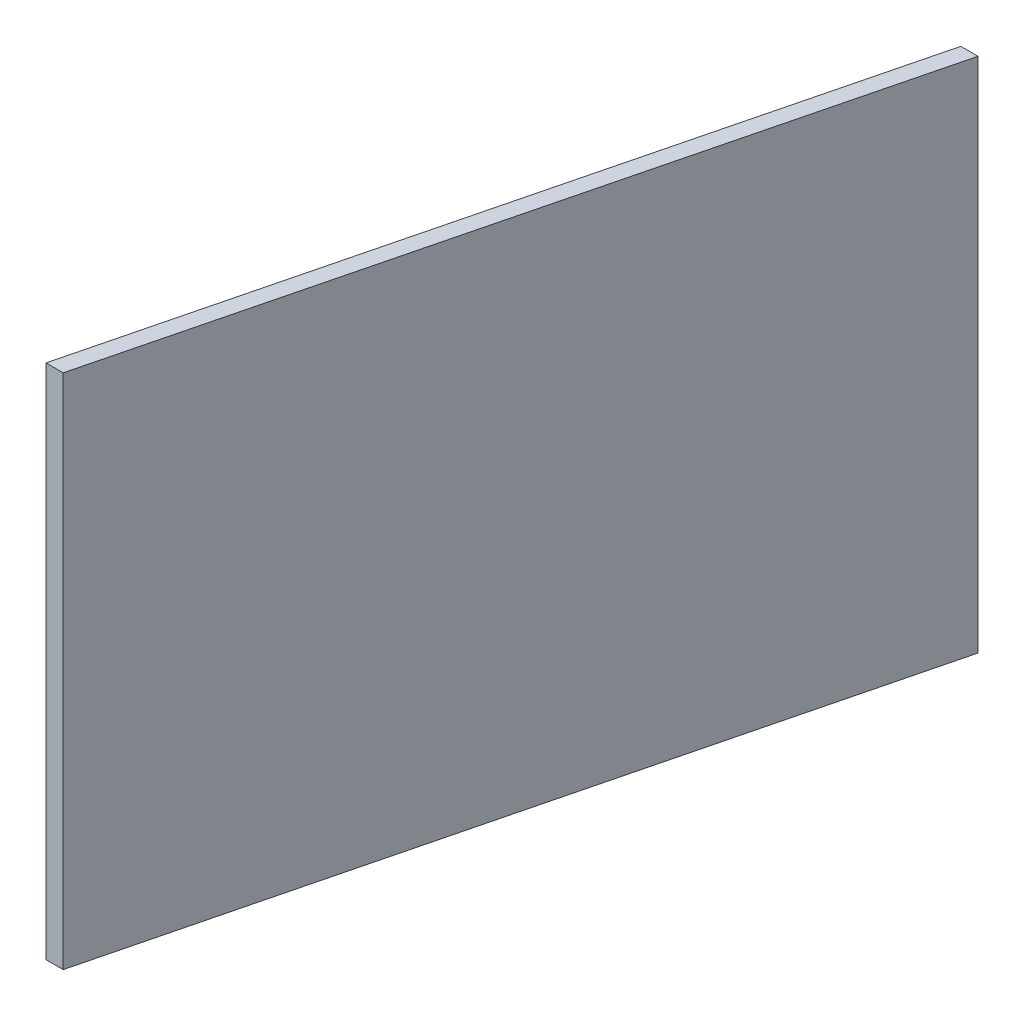
ISO-10303-21;
HEADER;
FILE_DESCRIPTION(('STEP AP214'),'2;1');
FILE_NAME('part.step','',(''),(''),'','','');
FILE_SCHEMA(('AUTOMOTIVE_DESIGN { 1 0 10303 214 1 1 1 1 }'));
ENDSEC;
DATA;
#1=APPLICATION_CONTEXT('core data for automotive mechanical design processes');
#2=APPLICATION_PROTOCOL_DEFINITION('international standard','automotive_design',2000,#1);
#3=PRODUCT_CONTEXT('',#1,'mechanical');
#4=PRODUCT('Part','Part','',(#3));
#5=PRODUCT_RELATED_PRODUCT_CATEGORY('part','',(#4));
#6=PRODUCT_DEFINITION_FORMATION('','',#4);
#7=PRODUCT_DEFINITION_CONTEXT('part definition',#1,'design');
#8=PRODUCT_DEFINITION('design','',#6,#7);
#9=PRODUCT_DEFINITION_SHAPE('','',#8);
#10=(LENGTH_UNIT() NAMED_UNIT(*) SI_UNIT(.MILLI.,.METRE.));
#11=(NAMED_UNIT(*) PLANE_ANGLE_UNIT() SI_UNIT($,.RADIAN.));
#12=(NAMED_UNIT(*) SI_UNIT($,.STERADIAN.) SOLID_ANGLE_UNIT());
#13=UNCERTAINTY_MEASURE_WITH_UNIT(LENGTH_MEASURE(1.E-05),#10,'distance_accuracy_value','');
#14=(GEOMETRIC_REPRESENTATION_CONTEXT(3) GLOBAL_UNCERTAINTY_ASSIGNED_CONTEXT((#13)) GLOBAL_UNIT_ASSIGNED_CONTEXT((#10,
#11,#12)) REPRESENTATION_CONTEXT('',''));
#15=CARTESIAN_POINT('',(0.,0.,0.));
#16=DIRECTION('',(0.,0.,1.));
#17=DIRECTION('',(1.,0.,0.));
#18=AXIS2_PLACEMENT_3D('',#15,#16,#17);
#19=CARTESIAN_POINT('',(-130.251324084295,0.00216424071563884,-33.3741438474182));
#20=DIRECTION('',(0.970037387299631,-1.57551485789192E-05,0.242955689360593));
#21=DIRECTION('',(0.242955689390747,0.,-0.970037387420025));
#22=AXIS2_PLACEMENT_3D('',#19,#20,#21);
#23=PLANE('',#22);
#24=CARTESIAN_POINT('',(-183.005669844466,113.192378864667,177.259987405333));
#25=DIRECTION('',(0.242966163072334,-2.27752633245057E-05,-0.970034763852923));
#26=VECTOR('',#25,1.);
#27=LINE('',#24,#26);
#28=CARTESIAN_POINT('',(-183.005325240059,113.19237885907,177.260073714997));
#29=VERTEX_POINT('',#28);
#30=CARTESIAN_POINT('',(-151.031083582132,113.189381590886,49.6009953438498));
#31=VERTEX_POINT('',#30);
#32=EDGE_CURVE('E85',#29,#31,#27,.T.);
#33=ORIENTED_EDGE('',*,*,#32,.F.);
#34=CARTESIAN_POINT('',(-183.005669844465,23.,177.259987405333));
#35=DIRECTION('',(0.,1.,0.));
#36=VECTOR('',#35,1.);
#37=LINE('',#34,#36);
#38=CARTESIAN_POINT('',(-183.006014448872,23.000000005597,177.259901095669));
#39=VERTEX_POINT('',#38);
#40=EDGE_CURVE('E106',#39,#29,#37,.T.);
#41=ORIENTED_EDGE('',*,*,#40,.F.);
#42=CARTESIAN_POINT('',(-151.033408915027,23.,49.6000444173306));
#43=DIRECTION('',(-0.242945215298195,0.,0.970040010702504));
#44=VECTOR('',#43,1.);
#45=LINE('',#42,#44);
#46=CARTESIAN_POINT('',(-151.03306431062,22.999999994403,49.6001307269948));
#47=VERTEX_POINT('',#46);
#48=EDGE_CURVE('E115',#47,#39,#45,.T.);
#49=ORIENTED_EDGE('',*,*,#48,.F.);
#50=CARTESIAN_POINT('',(-151.030738977725,113.189381585289,49.6010816535141));
#51=DIRECTION('',(-2.96036767731008E-05,-0.999999999495679,-1.15006463589839E-05));
#52=VECTOR('',#51,1.);
#53=LINE('',#50,#52);
#54=EDGE_CURVE('E123',#31,#47,#53,.T.);
#55=ORIENTED_EDGE('',*,*,#54,.F.);
#56=EDGE_LOOP('',(#33,#41,#49,#55));
#57=FACE_BOUND('',#56,.T.);
#58=ADVANCED_FACE('F74',(#57),#23,.T.);
#59=CARTESIAN_POINT('',(-133.251324084295,0.00216424071563884,-33.3741438474182));
#60=DIRECTION('',(0.970037387299631,-1.57551485789192E-05,0.242955689360593));
#61=DIRECTION('',(0.242955689390747,0.,-0.970037387420025));
#62=AXIS2_PLACEMENT_3D('',#59,#60,#61);
#63=PLANE('',#62);
#64=CARTESIAN_POINT('',(-186.004980635652,113.192378853473,177.260160024662));
#65=DIRECTION('',(0.242955688979662,-2.27750932077191E-05,-0.970037387255622));
#66=VECTOR('',#65,1.);
#67=LINE('',#64,#66);
#68=CARTESIAN_POINT('',(-186.005325240059,113.19237885907,177.260073714997));
#69=VERTEX_POINT('',#68);
#70=CARTESIAN_POINT('',(-154.031083582132,113.189381590886,49.6009953438498));
#71=VERTEX_POINT('',#70);
#72=EDGE_CURVE('E12',#69,#71,#67,.T.);
#73=ORIENTED_EDGE('',*,*,#72,.T.);
#74=CARTESIAN_POINT('',(-154.031428186538,113.189381596483,49.6009090341856));
#75=DIRECTION('',(-1.43200857131252E-05,-0.999999999868032,-7.67271616780447E-06));
#76=VECTOR('',#75,1.);
#77=LINE('',#74,#76);
#78=CARTESIAN_POINT('',(-154.03306431062,22.999999994403,49.6001307269948));
#79=VERTEX_POINT('',#78);
#80=EDGE_CURVE('E143',#71,#79,#77,.T.);
#81=ORIENTED_EDGE('',*,*,#80,.T.);
#82=CARTESIAN_POINT('',(-154.032719706214,22.999999988806,49.6002170366591));
#83=DIRECTION('',(-0.242955689390745,1.70117836762201E-10,0.970037387420025));
#84=VECTOR('',#83,1.);
#85=LINE('',#82,#84);
#86=CARTESIAN_POINT('',(-186.006014448872,23.000000005597,177.259901095669));
#87=VERTEX_POINT('',#86);
#88=EDGE_CURVE('E131',#79,#87,#85,.T.);
#89=ORIENTED_EDGE('',*,*,#88,.T.);
#90=CARTESIAN_POINT('',(-186.006359053279,23.000000011194,177.259814786004));
#91=DIRECTION('',(1.52830831660012E-05,0.999999999875888,3.82780298464996E-06));
#92=VECTOR('',#91,1.);
#93=LINE('',#90,#92);
#94=EDGE_CURVE('E231',#87,#69,#93,.T.);
#95=ORIENTED_EDGE('',*,*,#94,.T.);
#96=EDGE_LOOP('',(#73,#81,#89,#95));
#97=FACE_BOUND('',#96,.T.);
#98=ADVANCED_FACE('F147',(#97),#63,.F.);
#99=CARTESIAN_POINT('',(-186.005669844465,23.,177.259987405333));
#100=DIRECTION('',(0.,0.,-1.));
#101=DIRECTION('',(0.,1.,0.));
#102=AXIS2_PLACEMENT_3D('',#99,#100,#101);
#103=PLANE('',#102);
#104=ORIENTED_EDGE('',*,*,#40,.T.);
#105=DIRECTION('',(1.,0.,0.));
#106=VECTOR('',#105,1.);
#107=CARTESIAN_POINT('',(-186.005669844466,113.192378864667,177.259987405333));
#108=LINE('',#107,#106);
#109=EDGE_CURVE('E233',#69,#29,#108,.T.);
#110=ORIENTED_EDGE('',*,*,#109,.F.);
#111=ORIENTED_EDGE('',*,*,#94,.F.);
#112=DIRECTION('',(1.,0.,0.));
#113=VECTOR('',#112,1.);
#114=CARTESIAN_POINT('',(-186.005669844465,23.,177.259987405333));
#115=LINE('',#114,#113);
#116=EDGE_CURVE('E135',#87,#39,#115,.T.);
#117=ORIENTED_EDGE('',*,*,#116,.T.);
#118=EDGE_LOOP('',(#104,#110,#111,#117));
#119=FACE_BOUND('',#118,.T.);
#120=ADVANCED_FACE('F167',(#119),#103,.F.);
#121=CARTESIAN_POINT('',(-154.033408915027,23.,49.6000444173306));
#122=DIRECTION('',(0.,1.,0.));
#123=DIRECTION('',(0.,0.,1.));
#124=AXIS2_PLACEMENT_3D('',#121,#122,#123);
#125=PLANE('',#124);
#126=ORIENTED_EDGE('',*,*,#48,.T.);
#127=ORIENTED_EDGE('',*,*,#116,.F.);
#128=ORIENTED_EDGE('',*,*,#88,.F.);
#129=DIRECTION('',(1.,0.,0.));
#130=VECTOR('',#129,1.);
#131=CARTESIAN_POINT('',(-154.033408915027,23.,49.6000444173306));
#132=LINE('',#131,#130);
#133=EDGE_CURVE('E134',#79,#47,#132,.T.);
#134=ORIENTED_EDGE('',*,*,#133,.T.);
#135=EDGE_LOOP('',(#126,#127,#128,#134));
#136=FACE_BOUND('',#135,.T.);
#137=ADVANCED_FACE('F133',(#136),#125,.F.);
#138=CARTESIAN_POINT('',(-154.030738977725,113.189381585289,49.6010816535141));
#139=DIRECTION('',(0.,-1.15006463640233E-05,0.999999999933868));
#140=DIRECTION('',(0.,-0.999999999933868,-1.15006463640233E-05));
#141=AXIS2_PLACEMENT_3D('',#138,#139,#140);
#142=PLANE('',#141);
#143=ORIENTED_EDGE('',*,*,#54,.T.);
#144=ORIENTED_EDGE('',*,*,#133,.F.);
#145=ORIENTED_EDGE('',*,*,#80,.F.);
#146=DIRECTION('',(1.,0.,0.));
#147=VECTOR('',#146,1.);
#148=CARTESIAN_POINT('',(-154.030738977725,113.189381585289,49.6010816535141));
#149=LINE('',#148,#147);
#150=EDGE_CURVE('E149',#71,#31,#149,.T.);
#151=ORIENTED_EDGE('',*,*,#150,.T.);
#152=EDGE_LOOP('',(#143,#144,#145,#151));
#153=FACE_BOUND('',#152,.T.);
#154=ADVANCED_FACE('F142',(#153),#142,.F.);
#155=CARTESIAN_POINT('',(-186.005669844466,113.192378864667,177.259987405333));
#156=DIRECTION('',(0.,-0.999999999724373,2.34788114477116E-05));
#157=DIRECTION('',(0.,-2.34788114477116E-05,-0.999999999724373));
#158=AXIS2_PLACEMENT_3D('',#155,#156,#157);
#159=PLANE('',#158);
#160=ORIENTED_EDGE('',*,*,#32,.T.);
#161=ORIENTED_EDGE('',*,*,#150,.F.);
#162=ORIENTED_EDGE('',*,*,#72,.F.);
#163=ORIENTED_EDGE('',*,*,#109,.T.);
#164=EDGE_LOOP('',(#160,#161,#162,#163));
#165=FACE_BOUND('',#164,.T.);
#166=ADVANCED_FACE('F168',(#165),#159,.F.);
#167=CLOSED_SHELL('',(#58,#98,#120,#137,#154,#166));
#168=MANIFOLD_SOLID_BREP('B2',#167);
#169=ADVANCED_BREP_SHAPE_REPRESENTATION('',(#18,#168),#14);
#170=SHAPE_DEFINITION_REPRESENTATION(#9,#169);
ENDSEC;
END-ISO-10303-21;
